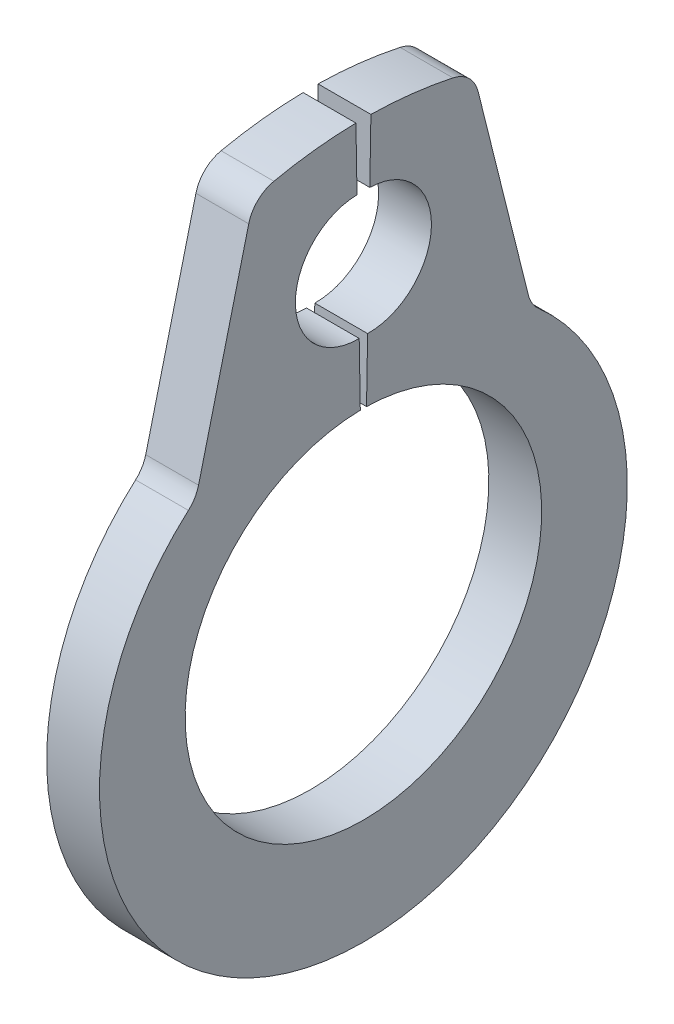
ISO-10303-21;
HEADER;
FILE_DESCRIPTION(('STEP AP214'),'2;1');
FILE_NAME('part.step','',(''),(''),'','','');
FILE_SCHEMA(('AUTOMOTIVE_DESIGN { 1 0 10303 214 1 1 1 1 }'));
ENDSEC;
DATA;
#1=APPLICATION_CONTEXT('core data for automotive mechanical design processes');
#2=APPLICATION_PROTOCOL_DEFINITION('international standard','automotive_design',2000,#1);
#3=PRODUCT_CONTEXT('',#1,'mechanical');
#4=PRODUCT('Part','Part','',(#3));
#5=PRODUCT_RELATED_PRODUCT_CATEGORY('part','',(#4));
#6=PRODUCT_DEFINITION_FORMATION('','',#4);
#7=PRODUCT_DEFINITION_CONTEXT('part definition',#1,'design');
#8=PRODUCT_DEFINITION('design','',#6,#7);
#9=PRODUCT_DEFINITION_SHAPE('','',#8);
#10=(LENGTH_UNIT() NAMED_UNIT(*) SI_UNIT(.MILLI.,.METRE.));
#11=(NAMED_UNIT(*) PLANE_ANGLE_UNIT() SI_UNIT($,.RADIAN.));
#12=(NAMED_UNIT(*) SI_UNIT($,.STERADIAN.) SOLID_ANGLE_UNIT());
#13=UNCERTAINTY_MEASURE_WITH_UNIT(LENGTH_MEASURE(1.E-05),#10,'distance_accuracy_value','');
#14=(GEOMETRIC_REPRESENTATION_CONTEXT(3) GLOBAL_UNCERTAINTY_ASSIGNED_CONTEXT((#13)) GLOBAL_UNIT_ASSIGNED_CONTEXT((#10,
#11,#12)) REPRESENTATION_CONTEXT('',''));
#15=CARTESIAN_POINT('',(0.,0.,0.));
#16=DIRECTION('',(0.,0.,1.));
#17=DIRECTION('',(1.,0.,0.));
#18=AXIS2_PLACEMENT_3D('',#15,#16,#17);
#19=CARTESIAN_POINT('',(0.2,0.,0.));
#20=DIRECTION('',(-1.,0.,0.));
#21=DIRECTION('',(0.,0.,1.));
#22=AXIS2_PLACEMENT_3D('',#19,#20,#21);
#23=CYLINDRICAL_SURFACE('',#22,1.35);
#24=CARTESIAN_POINT('',(-0.2,0.,0.));
#25=DIRECTION('',(-1.,0.,0.));
#26=DIRECTION('',(0.,0.,-1.));
#27=AXIS2_PLACEMENT_3D('',#24,#25,#26);
#28=CIRCLE('',#27,1.35);
#29=CARTESIAN_POINT('',(-0.2,1.34979438846113,-0.0235607486903328));
#30=VERTEX_POINT('',#29);
#31=CARTESIAN_POINT('',(-0.2,1.34979438846113,0.0235607486903328));
#32=VERTEX_POINT('',#31);
#33=EDGE_CURVE('E171',#30,#32,#28,.T.);
#34=ORIENTED_EDGE('',*,*,#33,.T.);
#35=DIRECTION('',(-1.,0.,0.));
#36=VECTOR('',#35,1.);
#37=CARTESIAN_POINT('',(0.2,1.34979438846113,0.0235607486903328));
#38=LINE('',#37,#36);
#39=CARTESIAN_POINT('',(0.2,1.34979438846113,0.0235607486903328));
#40=VERTEX_POINT('',#39);
#41=EDGE_CURVE('E152',#40,#32,#38,.T.);
#42=ORIENTED_EDGE('',*,*,#41,.F.);
#43=CARTESIAN_POINT('',(0.2,0.,0.));
#44=DIRECTION('',(-1.,0.,0.));
#45=DIRECTION('',(0.,0.,-1.));
#46=AXIS2_PLACEMENT_3D('',#43,#44,#45);
#47=CIRCLE('',#46,1.35);
#48=CARTESIAN_POINT('',(0.2,1.34979438846113,-0.0235607486903328));
#49=VERTEX_POINT('',#48);
#50=EDGE_CURVE('E158',#49,#40,#47,.T.);
#51=ORIENTED_EDGE('',*,*,#50,.F.);
#52=DIRECTION('',(-1.,0.,0.));
#53=VECTOR('',#52,1.);
#54=CARTESIAN_POINT('',(0.2,1.34979438846113,-0.0235607486903328));
#55=LINE('',#54,#53);
#56=EDGE_CURVE('E240',#49,#30,#55,.T.);
#57=ORIENTED_EDGE('',*,*,#56,.T.);
#58=EDGE_LOOP('',(#34,#42,#51,#57));
#59=FACE_BOUND('',#58,.T.);
#60=ADVANCED_FACE('F34',(#59),#23,.F.);
#61=CARTESIAN_POINT('',(0.2,1.82472204366041,0.0318506417480425));
#62=DIRECTION('',(0.,-0.0174524064372835,0.999847695156391));
#63=DIRECTION('',(0.,-0.999847695156391,-0.0174524064372835));
#64=AXIS2_PLACEMENT_3D('',#61,#62,#63);
#65=PLANE('',#64);
#66=DIRECTION('',(0.,0.999847695156391,0.0174524064372835));
#67=VECTOR('',#66,1.);
#68=CARTESIAN_POINT('',(-0.2,1.82472204366041,0.0318506417480425));
#69=LINE('',#68,#67);
#70=CARTESIAN_POINT('',(-0.2,1.82472204366041,0.0318506417480425));
#71=VERTEX_POINT('',#70);
#72=EDGE_CURVE('E242',#32,#71,#69,.T.);
#73=ORIENTED_EDGE('',*,*,#72,.T.);
#74=DIRECTION('',(-1.,0.,0.));
#75=VECTOR('',#74,1.);
#76=CARTESIAN_POINT('',(0.2,1.82472204366041,0.0318506417480425));
#77=LINE('',#76,#75);
#78=CARTESIAN_POINT('',(0.2,1.82472204366041,0.0318506417480425));
#79=VERTEX_POINT('',#78);
#80=EDGE_CURVE('E155',#79,#71,#77,.T.);
#81=ORIENTED_EDGE('',*,*,#80,.F.);
#82=DIRECTION('',(0.,0.999847695156391,0.0174524064372835));
#83=VECTOR('',#82,1.);
#84=CARTESIAN_POINT('',(0.2,1.82472204366041,0.0318506417480425));
#85=LINE('',#84,#83);
#86=EDGE_CURVE('E148',#40,#79,#85,.T.);
#87=ORIENTED_EDGE('',*,*,#86,.F.);
#88=ORIENTED_EDGE('',*,*,#41,.T.);
#89=EDGE_LOOP('',(#73,#81,#87,#88));
#90=FACE_BOUND('',#89,.T.);
#91=ADVANCED_FACE('F150',(#90),#65,.F.);
#92=CARTESIAN_POINT('',(0.2,2.2996496988597,0.0401405348057522));
#93=DIRECTION('',(-1.,0.,0.));
#94=DIRECTION('',(0.,0.,1.));
#95=AXIS2_PLACEMENT_3D('',#92,#93,#94);
#96=CYLINDRICAL_SURFACE('',#95,0.475);
#97=CARTESIAN_POINT('',(-0.2,2.2996496988597,0.0401405348057522));
#98=DIRECTION('',(-1.,0.,0.));
#99=DIRECTION('',(0.,0.,1.));
#100=AXIS2_PLACEMENT_3D('',#97,#98,#99);
#101=CIRCLE('',#100,0.475);
#102=CARTESIAN_POINT('',(-0.2,2.77457735405899,0.0484304278634618));
#103=VERTEX_POINT('',#102);
#104=EDGE_CURVE('E244',#71,#103,#101,.T.);
#105=ORIENTED_EDGE('',*,*,#104,.T.);
#106=DIRECTION('',(-1.,0.,0.));
#107=VECTOR('',#106,1.);
#108=CARTESIAN_POINT('',(0.2,2.77457735405899,0.0484304278634618));
#109=LINE('',#108,#107);
#110=CARTESIAN_POINT('',(0.2,2.77457735405899,0.0484304278634618));
#111=VERTEX_POINT('',#110);
#112=EDGE_CURVE('E176',#111,#103,#109,.T.);
#113=ORIENTED_EDGE('',*,*,#112,.F.);
#114=CARTESIAN_POINT('',(0.2,2.2996496988597,0.0401405348057522));
#115=DIRECTION('',(-1.,0.,0.));
#116=DIRECTION('',(0.,0.,1.));
#117=AXIS2_PLACEMENT_3D('',#114,#115,#116);
#118=CIRCLE('',#117,0.475);
#119=EDGE_CURVE('E157',#79,#111,#118,.T.);
#120=ORIENTED_EDGE('',*,*,#119,.F.);
#121=ORIENTED_EDGE('',*,*,#80,.T.);
#122=EDGE_LOOP('',(#105,#113,#120,#121));
#123=FACE_BOUND('',#122,.T.);
#124=ADVANCED_FACE('F302',(#123),#96,.F.);
#125=CARTESIAN_POINT('',(0.2,2.77457735405899,0.0484304278634618));
#126=DIRECTION('',(0.,-0.0174524064372836,0.999847695156391));
#127=DIRECTION('',(0.,-0.999847695156391,-0.0174524064372836));
#128=AXIS2_PLACEMENT_3D('',#125,#126,#127);
#129=PLANE('',#128);
#130=DIRECTION('',(0.,0.999847695156391,0.0174524064372836));
#131=VECTOR('',#130,1.);
#132=CARTESIAN_POINT('',(-0.2,2.77457735405899,0.0484304278634618));
#133=LINE('',#132,#131);
#134=CARTESIAN_POINT('',(-0.2,3.24950500925827,0.0567203209211715));
#135=VERTEX_POINT('',#134);
#136=EDGE_CURVE('E246',#103,#135,#133,.T.);
#137=ORIENTED_EDGE('',*,*,#136,.T.);
#138=DIRECTION('',(-1.,0.,0.));
#139=VECTOR('',#138,1.);
#140=CARTESIAN_POINT('',(0.2,3.24950500925827,0.0567203209211715));
#141=LINE('',#140,#139);
#142=CARTESIAN_POINT('',(0.2,3.24950500925827,0.0567203209211715));
#143=VERTEX_POINT('',#142);
#144=EDGE_CURVE('E271',#143,#135,#141,.T.);
#145=ORIENTED_EDGE('',*,*,#144,.F.);
#146=DIRECTION('',(0.,0.999847695156391,0.0174524064372836));
#147=VECTOR('',#146,1.);
#148=CARTESIAN_POINT('',(0.2,2.77457735405899,0.0484304278634618));
#149=LINE('',#148,#147);
#150=EDGE_CURVE('E280',#111,#143,#149,.T.);
#151=ORIENTED_EDGE('',*,*,#150,.F.);
#152=ORIENTED_EDGE('',*,*,#112,.T.);
#153=EDGE_LOOP('',(#137,#145,#151,#152));
#154=FACE_BOUND('',#153,.T.);
#155=ADVANCED_FACE('F278',(#154),#129,.F.);
#156=CARTESIAN_POINT('',(0.2,0.,0.));
#157=DIRECTION('',(-1.,0.,0.));
#158=DIRECTION('',(0.,0.,1.));
#159=AXIS2_PLACEMENT_3D('',#156,#157,#158);
#160=CYLINDRICAL_SURFACE('',#159,3.25);
#161=CARTESIAN_POINT('',(-0.2,0.,0.));
#162=DIRECTION('',(1.,0.,0.));
#163=DIRECTION('',(0.,0.,-1.));
#164=AXIS2_PLACEMENT_3D('',#161,#162,#163);
#165=CIRCLE('',#164,3.25);
#166=CARTESIAN_POINT('',(-0.2,3.17851500398699,0.677895544630294));
#167=VERTEX_POINT('',#166);
#168=EDGE_CURVE('E248',#135,#167,#165,.T.);
#169=ORIENTED_EDGE('',*,*,#168,.T.);
#170=DIRECTION('',(-1.,0.,0.));
#171=VECTOR('',#170,1.);
#172=CARTESIAN_POINT('',(0.2,3.17851500398699,0.677895544630294));
#173=LINE('',#172,#171);
#174=CARTESIAN_POINT('',(0.2,3.17851500398699,0.677895544630294));
#175=VERTEX_POINT('',#174);
#176=EDGE_CURVE('E191',#167,#175,#173,.F.);
#177=ORIENTED_EDGE('',*,*,#176,.T.);
#178=CARTESIAN_POINT('',(0.2,0.,0.));
#179=DIRECTION('',(1.,0.,0.));
#180=DIRECTION('',(0.,0.,-1.));
#181=AXIS2_PLACEMENT_3D('',#178,#179,#180);
#182=CIRCLE('',#181,3.25);
#183=EDGE_CURVE('E295',#143,#175,#182,.T.);
#184=ORIENTED_EDGE('',*,*,#183,.F.);
#185=ORIENTED_EDGE('',*,*,#144,.T.);
#186=EDGE_LOOP('',(#169,#177,#184,#185));
#187=FACE_BOUND('',#186,.T.);
#188=ADVANCED_FACE('F286',(#187),#160,.T.);
#189=CARTESIAN_POINT('',(0.2,3.14180689426359,0.831594516070064));
#190=DIRECTION('',(0.,-0.241921895599665,-0.970295726275997));
#191=DIRECTION('',(0.,0.970295726275997,-0.241921895599665));
#192=AXIS2_PLACEMENT_3D('',#189,#190,#191);
#193=PLANE('',#192);
#194=DIRECTION('',(0.,-0.970295726275997,0.241921895599665));
#195=VECTOR('',#194,1.);
#196=CARTESIAN_POINT('',(-0.2,3.14180689426359,0.831594516070064));
#197=LINE('',#196,#195);
#198=CARTESIAN_POINT('',(-0.2,2.99449432373406,0.868323665073886));
#199=VERTEX_POINT('',#198);
#200=CARTESIAN_POINT('',(-0.2,1.47050237748736,1.24829753338066));
#201=VERTEX_POINT('',#200);
#202=EDGE_CURVE('E222',#199,#201,#197,.T.);
#203=ORIENTED_EDGE('',*,*,#202,.T.);
#204=DIRECTION('',(1.,0.,0.));
#205=VECTOR('',#204,1.);
#206=CARTESIAN_POINT('',(0.2,1.47050237748736,1.24829753338066));
#207=LINE('',#206,#205);
#208=CARTESIAN_POINT('',(0.2,1.47050237748736,1.24829753338066));
#209=VERTEX_POINT('',#208);
#210=EDGE_CURVE('E185',#201,#209,#207,.T.);
#211=ORIENTED_EDGE('',*,*,#210,.T.);
#212=DIRECTION('',(0.,-0.970295726275997,0.241921895599665));
#213=VECTOR('',#212,1.);
#214=CARTESIAN_POINT('',(0.2,3.14180689426359,0.831594516070064));
#215=LINE('',#214,#213);
#216=CARTESIAN_POINT('',(0.2,2.99449432373406,0.868323665073886));
#217=VERTEX_POINT('',#216);
#218=EDGE_CURVE('E232',#217,#209,#215,.T.);
#219=ORIENTED_EDGE('',*,*,#218,.F.);
#220=DIRECTION('',(-1.,0.,0.));
#221=VECTOR('',#220,1.);
#222=CARTESIAN_POINT('',(0.2,2.99449432373406,0.868323665073886));
#223=LINE('',#222,#221);
#224=EDGE_CURVE('E182',#217,#199,#223,.T.);
#225=ORIENTED_EDGE('',*,*,#224,.T.);
#226=EDGE_LOOP('',(#203,#211,#219,#225));
#227=FACE_BOUND('',#226,.T.);
#228=ADVANCED_FACE('F297',(#227),#193,.F.);
#229=CARTESIAN_POINT('',(0.2,-0.151793308298937,0.));
#230=DIRECTION('',(-1.,0.,0.));
#231=DIRECTION('',(0.,0.,1.));
#232=AXIS2_PLACEMENT_3D('',#229,#230,#231);
#233=CYLINDRICAL_SURFACE('',#232,1.99820669170106);
#234=CARTESIAN_POINT('',(0.2,-0.151793308298937,0.));
#235=DIRECTION('',(1.,0.,0.));
#236=DIRECTION('',(0.,0.,-1.));
#237=AXIS2_PLACEMENT_3D('',#234,#235,#236);
#238=CIRCLE('',#237,1.99820669170106);
#239=CARTESIAN_POINT('',(0.2,1.34385857964017,1.32508694539759));
#240=VERTEX_POINT('',#239);
#241=CARTESIAN_POINT('',(0.2,1.34385857964016,-1.32508694539759));
#242=VERTEX_POINT('',#241);
#243=EDGE_CURVE('E226',#240,#242,#238,.T.);
#244=ORIENTED_EDGE('',*,*,#243,.F.);
#245=DIRECTION('',(-1.,0.,0.));
#246=VECTOR('',#245,1.);
#247=CARTESIAN_POINT('',(0.2,1.34385857964017,1.32508694539759));
#248=LINE('',#247,#246);
#249=CARTESIAN_POINT('',(-0.2,1.34385857964017,1.32508694539759));
#250=VERTEX_POINT('',#249);
#251=EDGE_CURVE('E174',#240,#250,#248,.T.);
#252=ORIENTED_EDGE('',*,*,#251,.T.);
#253=CARTESIAN_POINT('',(-0.2,-0.151793308298937,0.));
#254=DIRECTION('',(1.,0.,0.));
#255=DIRECTION('',(0.,0.,-1.));
#256=AXIS2_PLACEMENT_3D('',#253,#254,#255);
#257=CIRCLE('',#256,1.99820669170106);
#258=CARTESIAN_POINT('',(-0.2,1.34385857964016,-1.32508694539759));
#259=VERTEX_POINT('',#258);
#260=EDGE_CURVE('E212',#250,#259,#257,.T.);
#261=ORIENTED_EDGE('',*,*,#260,.T.);
#262=DIRECTION('',(-1.,0.,0.));
#263=VECTOR('',#262,1.);
#264=CARTESIAN_POINT('',(0.2,1.34385857964016,-1.32508694539759));
#265=LINE('',#264,#263);
#266=EDGE_CURVE('E172',#259,#242,#265,.F.);
#267=ORIENTED_EDGE('',*,*,#266,.T.);
#268=EDGE_LOOP('',(#244,#252,#261,#267));
#269=FACE_BOUND('',#268,.T.);
#270=ADVANCED_FACE('F219',(#269),#233,.T.);
#271=CARTESIAN_POINT('',(0.2,3.14180689426358,-0.831594516070064));
#272=DIRECTION('',(0.,-0.241921895599668,0.970295726275997));
#273=DIRECTION('',(0.,-0.970295726275997,-0.241921895599668));
#274=AXIS2_PLACEMENT_3D('',#271,#272,#273);
#275=PLANE('',#274);
#276=DIRECTION('',(0.,0.970295726275997,0.241921895599668));
#277=VECTOR('',#276,1.);
#278=CARTESIAN_POINT('',(-0.2,3.14180689426358,-0.831594516070064));
#279=LINE('',#278,#277);
#280=CARTESIAN_POINT('',(-0.2,1.47050237748736,-1.24829753338067));
#281=VERTEX_POINT('',#280);
#282=CARTESIAN_POINT('',(-0.2,2.99449432373405,-0.868323665073886));
#283=VERTEX_POINT('',#282);
#284=EDGE_CURVE('E213',#281,#283,#279,.T.);
#285=ORIENTED_EDGE('',*,*,#284,.T.);
#286=DIRECTION('',(-1.,0.,0.));
#287=VECTOR('',#286,1.);
#288=CARTESIAN_POINT('',(0.2,2.99449432373405,-0.868323665073886));
#289=LINE('',#288,#287);
#290=CARTESIAN_POINT('',(0.2,2.99449432373405,-0.868323665073886));
#291=VERTEX_POINT('',#290);
#292=EDGE_CURVE('E57',#283,#291,#289,.F.);
#293=ORIENTED_EDGE('',*,*,#292,.T.);
#294=DIRECTION('',(0.,0.970295726275997,0.241921895599668));
#295=VECTOR('',#294,1.);
#296=CARTESIAN_POINT('',(0.2,3.14180689426358,-0.831594516070064));
#297=LINE('',#296,#295);
#298=CARTESIAN_POINT('',(0.2,1.47050237748736,-1.24829753338067));
#299=VERTEX_POINT('',#298);
#300=EDGE_CURVE('E225',#299,#291,#297,.T.);
#301=ORIENTED_EDGE('',*,*,#300,.F.);
#302=DIRECTION('',(1.,0.,0.));
#303=VECTOR('',#302,1.);
#304=CARTESIAN_POINT('',(-0.2,1.47050237748736,-1.24829753338067));
#305=LINE('',#304,#303);
#306=EDGE_CURVE('E199',#299,#281,#305,.F.);
#307=ORIENTED_EDGE('',*,*,#306,.T.);
#308=EDGE_LOOP('',(#285,#293,#301,#307));
#309=FACE_BOUND('',#308,.T.);
#310=ADVANCED_FACE('F227',(#309),#275,.F.);
#311=CARTESIAN_POINT('',(0.2,0.,0.));
#312=DIRECTION('',(-1.,0.,0.));
#313=DIRECTION('',(0.,0.,1.));
#314=AXIS2_PLACEMENT_3D('',#311,#312,#313);
#315=CYLINDRICAL_SURFACE('',#314,3.24999999999999);
#316=CARTESIAN_POINT('',(0.2,0.,0.));
#317=DIRECTION('',(1.,0.,0.));
#318=DIRECTION('',(0.,0.,1.));
#319=AXIS2_PLACEMENT_3D('',#316,#317,#318);
#320=CIRCLE('',#319,3.24999999999999);
#321=CARTESIAN_POINT('',(0.2,3.17851500398698,-0.677895544630295));
#322=VERTEX_POINT('',#321);
#323=CARTESIAN_POINT('',(0.2,3.24950500925827,-0.0567203209211719));
#324=VERTEX_POINT('',#323);
#325=EDGE_CURVE('E228',#322,#324,#320,.T.);
#326=ORIENTED_EDGE('',*,*,#325,.F.);
#327=DIRECTION('',(-1.,0.,0.));
#328=VECTOR('',#327,1.);
#329=CARTESIAN_POINT('',(0.2,3.17851500398698,-0.677895544630295));
#330=LINE('',#329,#328);
#331=CARTESIAN_POINT('',(-0.2,3.17851500398698,-0.677895544630295));
#332=VERTEX_POINT('',#331);
#333=EDGE_CURVE('E196',#322,#332,#330,.T.);
#334=ORIENTED_EDGE('',*,*,#333,.T.);
#335=CARTESIAN_POINT('',(-0.2,0.,0.));
#336=DIRECTION('',(1.,0.,0.));
#337=DIRECTION('',(0.,0.,1.));
#338=AXIS2_PLACEMENT_3D('',#335,#336,#337);
#339=CIRCLE('',#338,3.24999999999999);
#340=CARTESIAN_POINT('',(-0.2,3.24950500925827,-0.0567203209211719));
#341=VERTEX_POINT('',#340);
#342=EDGE_CURVE('E254',#332,#341,#339,.T.);
#343=ORIENTED_EDGE('',*,*,#342,.T.);
#344=DIRECTION('',(-1.,0.,0.));
#345=VECTOR('',#344,1.);
#346=CARTESIAN_POINT('',(0.2,3.24950500925827,-0.0567203209211719));
#347=LINE('',#346,#345);
#348=EDGE_CURVE('E268',#324,#341,#347,.T.);
#349=ORIENTED_EDGE('',*,*,#348,.F.);
#350=EDGE_LOOP('',(#326,#334,#343,#349));
#351=FACE_BOUND('',#350,.T.);
#352=ADVANCED_FACE('F330',(#351),#315,.T.);
#353=CARTESIAN_POINT('',(0.2,2.77457735405898,-0.0484304278634622));
#354=DIRECTION('',(0.,-0.017452406437284,-0.999847695156391));
#355=DIRECTION('',(0.,0.999847695156391,-0.017452406437284));
#356=AXIS2_PLACEMENT_3D('',#353,#354,#355);
#357=PLANE('',#356);
#358=DIRECTION('',(0.,-0.999847695156391,0.017452406437284));
#359=VECTOR('',#358,1.);
#360=CARTESIAN_POINT('',(-0.2,2.77457735405898,-0.0484304278634622));
#361=LINE('',#360,#359);
#362=CARTESIAN_POINT('',(-0.2,2.77457735405898,-0.0484304278634622));
#363=VERTEX_POINT('',#362);
#364=EDGE_CURVE('E256',#341,#363,#361,.T.);
#365=ORIENTED_EDGE('',*,*,#364,.T.);
#366=DIRECTION('',(-1.,0.,0.));
#367=VECTOR('',#366,1.);
#368=CARTESIAN_POINT('',(0.2,2.77457735405898,-0.0484304278634622));
#369=LINE('',#368,#367);
#370=CARTESIAN_POINT('',(0.2,2.77457735405898,-0.0484304278634622));
#371=VERTEX_POINT('',#370);
#372=EDGE_CURVE('E265',#371,#363,#369,.T.);
#373=ORIENTED_EDGE('',*,*,#372,.F.);
#374=DIRECTION('',(0.,-0.999847695156391,0.017452406437284));
#375=VECTOR('',#374,1.);
#376=CARTESIAN_POINT('',(0.2,2.77457735405898,-0.0484304278634622));
#377=LINE('',#376,#375);
#378=EDGE_CURVE('E230',#324,#371,#377,.T.);
#379=ORIENTED_EDGE('',*,*,#378,.F.);
#380=ORIENTED_EDGE('',*,*,#348,.T.);
#381=EDGE_LOOP('',(#365,#373,#379,#380));
#382=FACE_BOUND('',#381,.T.);
#383=ADVANCED_FACE('F337',(#382),#357,.F.);
#384=CARTESIAN_POINT('',(0.2,2.2996496988597,-0.0401405348057525));
#385=DIRECTION('',(-1.,0.,0.));
#386=DIRECTION('',(0.,0.,1.));
#387=AXIS2_PLACEMENT_3D('',#384,#385,#386);
#388=CYLINDRICAL_SURFACE('',#387,0.475);
#389=CARTESIAN_POINT('',(-0.2,2.2996496988597,-0.0401405348057525));
#390=DIRECTION('',(-1.,0.,0.));
#391=DIRECTION('',(0.,0.,1.));
#392=AXIS2_PLACEMENT_3D('',#389,#390,#391);
#393=CIRCLE('',#392,0.475);
#394=CARTESIAN_POINT('',(-0.2,1.82472204366041,-0.031850641748043));
#395=VERTEX_POINT('',#394);
#396=EDGE_CURVE('E258',#363,#395,#393,.T.);
#397=ORIENTED_EDGE('',*,*,#396,.T.);
#398=DIRECTION('',(-1.,0.,0.));
#399=VECTOR('',#398,1.);
#400=CARTESIAN_POINT('',(0.2,1.82472204366041,-0.031850641748043));
#401=LINE('',#400,#399);
#402=CARTESIAN_POINT('',(0.2,1.82472204366041,-0.031850641748043));
#403=VERTEX_POINT('',#402);
#404=EDGE_CURVE('E262',#403,#395,#401,.T.);
#405=ORIENTED_EDGE('',*,*,#404,.F.);
#406=CARTESIAN_POINT('',(0.2,2.2996496988597,-0.0401405348057525));
#407=DIRECTION('',(-1.,0.,0.));
#408=DIRECTION('',(0.,0.,1.));
#409=AXIS2_PLACEMENT_3D('',#406,#407,#408);
#410=CIRCLE('',#409,0.475);
#411=EDGE_CURVE('E237',#371,#403,#410,.T.);
#412=ORIENTED_EDGE('',*,*,#411,.F.);
#413=ORIENTED_EDGE('',*,*,#372,.T.);
#414=EDGE_LOOP('',(#397,#405,#412,#413));
#415=FACE_BOUND('',#414,.T.);
#416=ADVANCED_FACE('F341',(#415),#388,.F.);
#417=CARTESIAN_POINT('',(0.2,1.34979438846113,-0.0235607486903328));
#418=DIRECTION('',(0.,-0.0174524064372842,-0.999847695156391));
#419=DIRECTION('',(0.,0.999847695156391,-0.0174524064372842));
#420=AXIS2_PLACEMENT_3D('',#417,#418,#419);
#421=PLANE('',#420);
#422=DIRECTION('',(0.,-0.999847695156391,0.0174524064372842));
#423=VECTOR('',#422,1.);
#424=CARTESIAN_POINT('',(-0.2,1.34979438846113,-0.0235607486903328));
#425=LINE('',#424,#423);
#426=EDGE_CURVE('E168',#395,#30,#425,.T.);
#427=ORIENTED_EDGE('',*,*,#426,.T.);
#428=ORIENTED_EDGE('',*,*,#56,.F.);
#429=DIRECTION('',(0.,-0.999847695156391,0.0174524064372842));
#430=VECTOR('',#429,1.);
#431=CARTESIAN_POINT('',(0.2,1.34979438846113,-0.0235607486903328));
#432=LINE('',#431,#430);
#433=EDGE_CURVE('E164',#403,#49,#432,.T.);
#434=ORIENTED_EDGE('',*,*,#433,.F.);
#435=ORIENTED_EDGE('',*,*,#404,.T.);
#436=EDGE_LOOP('',(#427,#428,#434,#435));
#437=FACE_BOUND('',#436,.T.);
#438=ADVANCED_FACE('F344',(#437),#421,.F.);
#439=CARTESIAN_POINT('',(0.2,0.,0.));
#440=DIRECTION('',(1.,0.,0.));
#441=DIRECTION('',(0.,0.,-1.));
#442=AXIS2_PLACEMENT_3D('',#439,#440,#441);
#443=PLANE('',#442);
#444=ORIENTED_EDGE('',*,*,#183,.T.);
#445=CARTESIAN_POINT('',(0.2,2.93401384983414,0.625749733504886));
#446=DIRECTION('',(1.,0.,0.));
#447=DIRECTION('',(0.,0.,-1.));
#448=AXIS2_PLACEMENT_3D('',#445,#446,#447);
#449=CIRCLE('',#448,0.25);
#450=EDGE_CURVE('E194',#175,#217,#449,.T.);
#451=ORIENTED_EDGE('',*,*,#450,.T.);
#452=ORIENTED_EDGE('',*,*,#218,.T.);
#453=CARTESIAN_POINT('',(0.2,1.53098285138728,1.49087146494966));
#454=DIRECTION('',(1.,0.,0.));
#455=DIRECTION('',(0.,0.,-1.));
#456=AXIS2_PLACEMENT_3D('',#453,#454,#455);
#457=CIRCLE('',#456,0.25);
#458=EDGE_CURVE('E205',#209,#240,#457,.F.);
#459=ORIENTED_EDGE('',*,*,#458,.T.);
#460=ORIENTED_EDGE('',*,*,#243,.T.);
#461=CARTESIAN_POINT('',(0.2,1.53098285138728,-1.49087146494967));
#462=DIRECTION('',(1.,0.,0.));
#463=DIRECTION('',(0.,0.,-1.));
#464=AXIS2_PLACEMENT_3D('',#461,#462,#463);
#465=CIRCLE('',#464,0.25);
#466=EDGE_CURVE('E11',#242,#299,#465,.F.);
#467=ORIENTED_EDGE('',*,*,#466,.T.);
#468=ORIENTED_EDGE('',*,*,#300,.T.);
#469=CARTESIAN_POINT('',(0.2,2.93401384983414,-0.625749733504887));
#470=DIRECTION('',(1.,0.,0.));
#471=DIRECTION('',(0.,0.,-1.));
#472=AXIS2_PLACEMENT_3D('',#469,#470,#471);
#473=CIRCLE('',#472,0.25);
#474=EDGE_CURVE('E49',#291,#322,#473,.T.);
#475=ORIENTED_EDGE('',*,*,#474,.T.);
#476=ORIENTED_EDGE('',*,*,#325,.T.);
#477=ORIENTED_EDGE('',*,*,#378,.T.);
#478=ORIENTED_EDGE('',*,*,#411,.T.);
#479=ORIENTED_EDGE('',*,*,#433,.T.);
#480=ORIENTED_EDGE('',*,*,#50,.T.);
#481=ORIENTED_EDGE('',*,*,#86,.T.);
#482=ORIENTED_EDGE('',*,*,#119,.T.);
#483=ORIENTED_EDGE('',*,*,#150,.T.);
#484=EDGE_LOOP('',(#444,#451,#452,#459,#460,#467,#468,#475,#476,#477,#478,#479,#480,#481,#482,#483));
#485=FACE_BOUND('',#484,.T.);
#486=ADVANCED_FACE('F162',(#485),#443,.T.);
#487=CARTESIAN_POINT('',(-0.2,0.,0.));
#488=DIRECTION('',(1.,0.,0.));
#489=DIRECTION('',(0.,0.,-1.));
#490=AXIS2_PLACEMENT_3D('',#487,#488,#489);
#491=PLANE('',#490);
#492=ORIENTED_EDGE('',*,*,#202,.F.);
#493=CARTESIAN_POINT('',(-0.2,2.93401384983414,0.625749733504886));
#494=DIRECTION('',(1.,0.,0.));
#495=DIRECTION('',(0.,0.,-1.));
#496=AXIS2_PLACEMENT_3D('',#493,#494,#495);
#497=CIRCLE('',#496,0.25);
#498=EDGE_CURVE('E189',#199,#167,#497,.F.);
#499=ORIENTED_EDGE('',*,*,#498,.T.);
#500=ORIENTED_EDGE('',*,*,#168,.F.);
#501=ORIENTED_EDGE('',*,*,#136,.F.);
#502=ORIENTED_EDGE('',*,*,#104,.F.);
#503=ORIENTED_EDGE('',*,*,#72,.F.);
#504=ORIENTED_EDGE('',*,*,#33,.F.);
#505=ORIENTED_EDGE('',*,*,#426,.F.);
#506=ORIENTED_EDGE('',*,*,#396,.F.);
#507=ORIENTED_EDGE('',*,*,#364,.F.);
#508=ORIENTED_EDGE('',*,*,#342,.F.);
#509=CARTESIAN_POINT('',(-0.2,2.93401384983414,-0.625749733504887));
#510=DIRECTION('',(1.,0.,0.));
#511=DIRECTION('',(0.,0.,-1.));
#512=AXIS2_PLACEMENT_3D('',#509,#510,#511);
#513=CIRCLE('',#512,0.25);
#514=EDGE_CURVE('E187',#332,#283,#513,.F.);
#515=ORIENTED_EDGE('',*,*,#514,.T.);
#516=ORIENTED_EDGE('',*,*,#284,.F.);
#517=CARTESIAN_POINT('',(-0.2,1.53098285138728,-1.49087146494967));
#518=DIRECTION('',(1.,0.,0.));
#519=DIRECTION('',(0.,0.,-1.));
#520=AXIS2_PLACEMENT_3D('',#517,#518,#519);
#521=CIRCLE('',#520,0.25);
#522=EDGE_CURVE('E42',#281,#259,#521,.T.);
#523=ORIENTED_EDGE('',*,*,#522,.T.);
#524=ORIENTED_EDGE('',*,*,#260,.F.);
#525=CARTESIAN_POINT('',(-0.2,1.53098285138728,1.49087146494966));
#526=DIRECTION('',(1.,0.,0.));
#527=DIRECTION('',(0.,0.,-1.));
#528=AXIS2_PLACEMENT_3D('',#525,#526,#527);
#529=CIRCLE('',#528,0.25);
#530=EDGE_CURVE('E203',#250,#201,#529,.T.);
#531=ORIENTED_EDGE('',*,*,#530,.T.);
#532=EDGE_LOOP('',(#492,#499,#500,#501,#502,#503,#504,#505,#506,#507,#508,#515,#516,#523,#524,#531));
#533=FACE_BOUND('',#532,.T.);
#534=ADVANCED_FACE('F211',(#533),#491,.F.);
#535=CARTESIAN_POINT('',(0.2,1.53098285138728,1.49087146494966));
#536=DIRECTION('',(-1.,0.,0.));
#537=DIRECTION('',(0.,0.,1.));
#538=AXIS2_PLACEMENT_3D('',#535,#536,#537);
#539=CYLINDRICAL_SURFACE('',#538,0.25);
#540=ORIENTED_EDGE('',*,*,#458,.F.);
#541=ORIENTED_EDGE('',*,*,#210,.F.);
#542=ORIENTED_EDGE('',*,*,#530,.F.);
#543=ORIENTED_EDGE('',*,*,#251,.F.);
#544=EDGE_LOOP('',(#540,#541,#542,#543));
#545=FACE_BOUND('',#544,.T.);
#546=ADVANCED_FACE('F316',(#545),#539,.F.);
#547=CARTESIAN_POINT('',(0.2,2.93401384983414,0.625749733504886));
#548=DIRECTION('',(-1.,0.,0.));
#549=DIRECTION('',(0.,0.,1.));
#550=AXIS2_PLACEMENT_3D('',#547,#548,#549);
#551=CYLINDRICAL_SURFACE('',#550,0.25);
#552=ORIENTED_EDGE('',*,*,#450,.F.);
#553=ORIENTED_EDGE('',*,*,#176,.F.);
#554=ORIENTED_EDGE('',*,*,#498,.F.);
#555=ORIENTED_EDGE('',*,*,#224,.F.);
#556=EDGE_LOOP('',(#552,#553,#554,#555));
#557=FACE_BOUND('',#556,.T.);
#558=ADVANCED_FACE('F290',(#557),#551,.T.);
#559=CARTESIAN_POINT('',(0.2,2.93401384983414,-0.625749733504887));
#560=DIRECTION('',(-1.,0.,0.));
#561=DIRECTION('',(0.,0.,1.));
#562=AXIS2_PLACEMENT_3D('',#559,#560,#561);
#563=CYLINDRICAL_SURFACE('',#562,0.25);
#564=ORIENTED_EDGE('',*,*,#474,.F.);
#565=ORIENTED_EDGE('',*,*,#292,.F.);
#566=ORIENTED_EDGE('',*,*,#514,.F.);
#567=ORIENTED_EDGE('',*,*,#333,.F.);
#568=EDGE_LOOP('',(#564,#565,#566,#567));
#569=FACE_BOUND('',#568,.T.);
#570=ADVANCED_FACE('F321',(#569),#563,.T.);
#571=CARTESIAN_POINT('',(0.2,1.53098285138728,-1.49087146494967));
#572=DIRECTION('',(-1.,0.,0.));
#573=DIRECTION('',(0.,0.,1.));
#574=AXIS2_PLACEMENT_3D('',#571,#572,#573);
#575=CYLINDRICAL_SURFACE('',#574,0.25);
#576=ORIENTED_EDGE('',*,*,#466,.F.);
#577=ORIENTED_EDGE('',*,*,#266,.F.);
#578=ORIENTED_EDGE('',*,*,#522,.F.);
#579=ORIENTED_EDGE('',*,*,#306,.F.);
#580=EDGE_LOOP('',(#576,#577,#578,#579));
#581=FACE_BOUND('',#580,.T.);
#582=ADVANCED_FACE('F36',(#581),#575,.F.);
#583=CLOSED_SHELL('',(#60,#91,#124,#155,#188,#228,#270,#310,#352,#383,#416,#438,#486,#534,#546,
#558,#570,#582));
#584=MANIFOLD_SOLID_BREP('B2',#583);
#585=ADVANCED_BREP_SHAPE_REPRESENTATION('',(#18,#584),#14);
#586=SHAPE_DEFINITION_REPRESENTATION(#9,#585);
ENDSEC;
END-ISO-10303-21;
